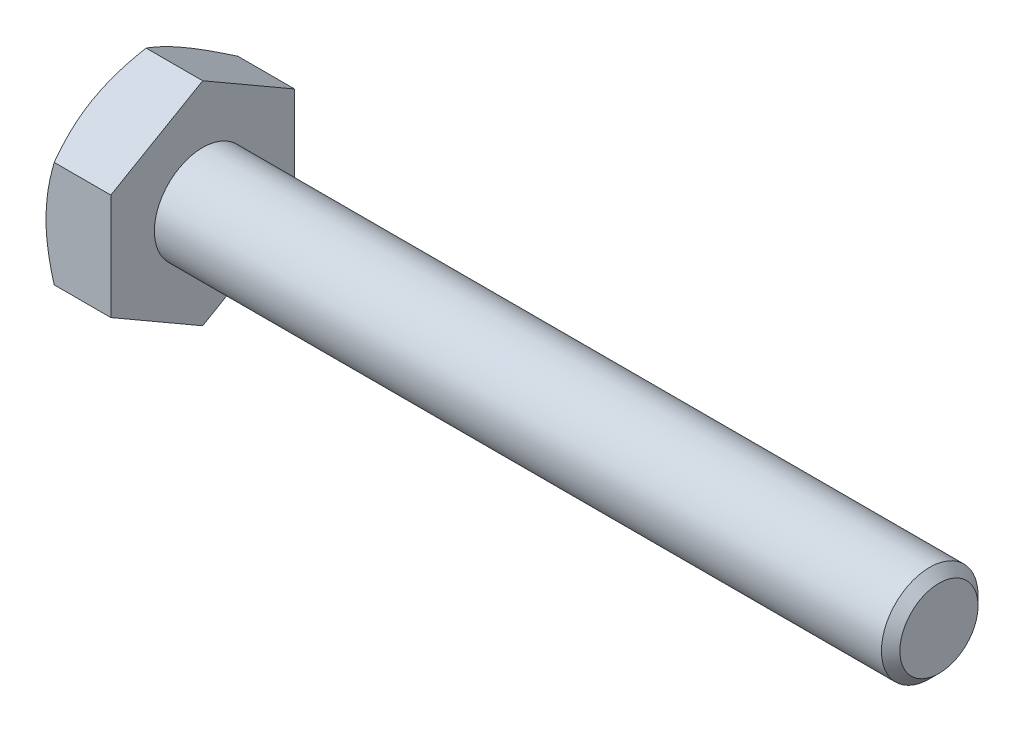
ISO-10303-21;
HEADER;
FILE_DESCRIPTION(('STEP AP214'),'2;1');
FILE_NAME('part.step','',(''),(''),'','','');
FILE_SCHEMA(('AUTOMOTIVE_DESIGN { 1 0 10303 214 1 1 1 1 }'));
ENDSEC;
DATA;
#1=APPLICATION_CONTEXT('core data for automotive mechanical design processes');
#2=APPLICATION_PROTOCOL_DEFINITION('international standard','automotive_design',2000,#1);
#3=PRODUCT_CONTEXT('',#1,'mechanical');
#4=PRODUCT('Part','Part','',(#3));
#5=PRODUCT_RELATED_PRODUCT_CATEGORY('part','',(#4));
#6=PRODUCT_DEFINITION_FORMATION('','',#4);
#7=PRODUCT_DEFINITION_CONTEXT('part definition',#1,'design');
#8=PRODUCT_DEFINITION('design','',#6,#7);
#9=PRODUCT_DEFINITION_SHAPE('','',#8);
#10=(LENGTH_UNIT() NAMED_UNIT(*) SI_UNIT(.MILLI.,.METRE.));
#11=(NAMED_UNIT(*) PLANE_ANGLE_UNIT() SI_UNIT($,.RADIAN.));
#12=(NAMED_UNIT(*) SI_UNIT($,.STERADIAN.) SOLID_ANGLE_UNIT());
#13=UNCERTAINTY_MEASURE_WITH_UNIT(LENGTH_MEASURE(1.E-05),#10,'distance_accuracy_value','');
#14=(GEOMETRIC_REPRESENTATION_CONTEXT(3) GLOBAL_UNCERTAINTY_ASSIGNED_CONTEXT((#13)) GLOBAL_UNIT_ASSIGNED_CONTEXT((#10,
#11,#12)) REPRESENTATION_CONTEXT('',''));
#15=CARTESIAN_POINT('',(0.,0.,0.));
#16=DIRECTION('',(0.,0.,1.));
#17=DIRECTION('',(1.,0.,0.));
#18=AXIS2_PLACEMENT_3D('',#15,#16,#17);
#19=CARTESIAN_POINT('',(-2.5136,0.,0.));
#20=DIRECTION('',(1.,0.,0.));
#21=DIRECTION('',(0.,1.,0.));
#22=AXIS2_PLACEMENT_3D('',#19,#20,#21);
#23=PLANE('',#22);
#24=CARTESIAN_POINT('',(-2.5136,0.,0.));
#25=DIRECTION('',(1.,0.,0.));
#26=DIRECTION('',(0.,1.,0.));
#27=AXIS2_PLACEMENT_3D('',#24,#25,#26);
#28=CIRCLE('',#27,3.16992);
#29=CARTESIAN_POINT('',(-2.5136,3.16992,0.));
#30=VERTEX_POINT('',#29);
#31=EDGE_CURVE('E20',#30,#30,#28,.F.);
#32=ORIENTED_EDGE('',*,*,#31,.T.);
#33=EDGE_LOOP('',(#32));
#34=FACE_BOUND('',#33,.T.);
#35=ADVANCED_FACE('F17',(#34),#23,.F.);
#36=CARTESIAN_POINT('',(-2.794,0.,0.));
#37=DIRECTION('',(1.,0.,0.));
#38=DIRECTION('',(0.,1.,0.));
#39=AXIS2_PLACEMENT_3D('',#36,#37,#38);
#40=CYLINDRICAL_SURFACE('',#39,3.16992);
#41=CARTESIAN_POINT('',(-2.794,0.,0.));
#42=DIRECTION('',(1.,0.,0.));
#43=DIRECTION('',(0.,1.,0.));
#44=AXIS2_PLACEMENT_3D('',#41,#42,#43);
#45=CIRCLE('',#44,3.16992);
#46=CARTESIAN_POINT('',(-2.794,3.16992,0.));
#47=VERTEX_POINT('',#46);
#48=EDGE_CURVE('E115',#47,#47,#45,.F.);
#49=ORIENTED_EDGE('',*,*,#48,.T.);
#50=EDGE_LOOP('',(#49));
#51=FACE_BOUND('',#50,.T.);
#52=ORIENTED_EDGE('',*,*,#31,.F.);
#53=EDGE_LOOP('',(#52));
#54=FACE_BOUND('',#53,.T.);
#55=ADVANCED_FACE('F348',(#51,#54),#40,.F.);
#56=CARTESIAN_POINT('',(-2.794,0.,0.));
#57=DIRECTION('',(1.,0.,0.));
#58=DIRECTION('',(0.,1.,0.));
#59=AXIS2_PLACEMENT_3D('',#56,#57,#58);
#60=PLANE('',#59);
#61=ORIENTED_EDGE('',*,*,#48,.F.);
#62=EDGE_LOOP('',(#61));
#63=FACE_BOUND('',#62,.T.);
#64=CARTESIAN_POINT('',(-2.79399999999441,0.,0.));
#65=DIRECTION('',(1.,0.,0.));
#66=DIRECTION('',(0.,0.,-1.));
#67=AXIS2_PLACEMENT_3D('',#64,#65,#66);
#68=CIRCLE('',#67,3.96239999997761);
#69=CARTESIAN_POINT('',(-2.79399999998795,3.43153905994576,-1.9811999999944));
#70=VERTEX_POINT('',#69);
#71=CARTESIAN_POINT('',(-2.79399999998795,3.43153905994576,1.9811999999944));
#72=VERTEX_POINT('',#71);
#73=EDGE_CURVE('E333',#70,#72,#68,.T.);
#74=ORIENTED_EDGE('',*,*,#73,.F.);
#75=CARTESIAN_POINT('',(-2.79399999999441,0.,0.));
#76=DIRECTION('',(1.,0.,0.));
#77=DIRECTION('',(0.,0.,-1.));
#78=AXIS2_PLACEMENT_3D('',#75,#76,#77);
#79=CIRCLE('',#78,3.96239999997761);
#80=CARTESIAN_POINT('',(-2.79399999998795,0.,-3.9623999999888));
#81=VERTEX_POINT('',#80);
#82=EDGE_CURVE('E334',#81,#70,#79,.T.);
#83=ORIENTED_EDGE('',*,*,#82,.F.);
#84=CARTESIAN_POINT('',(-2.79399999999441,0.,0.));
#85=DIRECTION('',(1.,0.,0.));
#86=DIRECTION('',(0.,0.,-1.));
#87=AXIS2_PLACEMENT_3D('',#84,#85,#86);
#88=CIRCLE('',#87,3.96239999997761);
#89=CARTESIAN_POINT('',(-2.79399999998795,-3.43153905994576,-1.9811999999944));
#90=VERTEX_POINT('',#89);
#91=EDGE_CURVE('E336',#90,#81,#88,.T.);
#92=ORIENTED_EDGE('',*,*,#91,.F.);
#93=CARTESIAN_POINT('',(-2.79399999999441,0.,0.));
#94=DIRECTION('',(1.,0.,0.));
#95=DIRECTION('',(0.,0.,-1.));
#96=AXIS2_PLACEMENT_3D('',#93,#94,#95);
#97=CIRCLE('',#96,3.96239999997761);
#98=CARTESIAN_POINT('',(-2.79399999998795,-3.43153905994576,1.9811999999944));
#99=VERTEX_POINT('',#98);
#100=EDGE_CURVE('E93',#99,#90,#97,.T.);
#101=ORIENTED_EDGE('',*,*,#100,.F.);
#102=CARTESIAN_POINT('',(-2.79399999999441,0.,0.));
#103=DIRECTION('',(1.,0.,0.));
#104=DIRECTION('',(0.,0.,-1.));
#105=AXIS2_PLACEMENT_3D('',#102,#103,#104);
#106=CIRCLE('',#105,3.96239999997761);
#107=CARTESIAN_POINT('',(-2.79399999998795,0.,3.9623999999888));
#108=VERTEX_POINT('',#107);
#109=EDGE_CURVE('E89',#108,#99,#106,.T.);
#110=ORIENTED_EDGE('',*,*,#109,.F.);
#111=CARTESIAN_POINT('',(-2.79399999999441,0.,0.));
#112=DIRECTION('',(1.,0.,0.));
#113=DIRECTION('',(0.,0.,-1.));
#114=AXIS2_PLACEMENT_3D('',#111,#112,#113);
#115=CIRCLE('',#114,3.96239999997761);
#116=EDGE_CURVE('E86',#72,#108,#115,.T.);
#117=ORIENTED_EDGE('',*,*,#116,.F.);
#118=EDGE_LOOP('',(#74,#83,#92,#101,#110,#117));
#119=FACE_BOUND('',#118,.T.);
#120=ADVANCED_FACE('F91',(#63,#119),#60,.F.);
#121=CARTESIAN_POINT('',(-2.43796926281448,0.,0.));
#122=DIRECTION('',(1.,0.,0.));
#123=DIRECTION('',(0.,0.,-1.));
#124=AXIS2_PLACEMENT_3D('',#121,#122,#123);
#125=CONICAL_SURFACE('',#124,4.5790633258207,1.04719755119045);
#126=ORIENTED_EDGE('',*,*,#116,.T.);
#127=CARTESIAN_POINT('',(-2.44009270661787,2.28769270663145,3.96240000000435));
#128=CARTESIAN_POINT('',(-2.49386247127216,2.10147549504004,3.96240000000152));
#129=CARTESIAN_POINT('',(-2.54312496324145,1.91376698910034,3.9624000000004));
#130=CARTESIAN_POINT('',(-2.6299984808673,1.53669534529914,3.9623999999996));
#131=CARTESIAN_POINT('',(-2.66766712049076,1.34734536003662,3.96239999999993));
#132=CARTESIAN_POINT('',(-2.7139178146395,1.06153337782341,3.96240000000004));
#133=CARTESIAN_POINT('',(-2.72763161631743,0.965901675390238,3.96240000000001));
#134=CARTESIAN_POINT('',(-2.75137049289247,0.7741804425831,3.96239999999999));
#135=CARTESIAN_POINT('',(-2.7613956648771,0.678090924326633,3.9624));
#136=CARTESIAN_POINT('',(-2.77758113996479,0.485098636636699,3.9624));
#137=CARTESIAN_POINT('',(-2.78372178856325,0.388194206185193,3.9624));
#138=CARTESIAN_POINT('',(-2.79193971803073,0.194194765652607,3.9624));
#139=CARTESIAN_POINT('',(-2.79401619416263,0.0970997216376882,3.96239999999999));
#140=CARTESIAN_POINT('',(-2.79399999998148,0.,3.9624));
#141=B_SPLINE_CURVE_WITH_KNOTS('',3,(#127,#128,#129,#130,#131,#132,#133,#134,#135,#136,#137,
#138,#139,#140),.UNSPECIFIED.,.F.,.F.,(4,2,2,2,2,2,4),(0.,0.58170937104,1.16047952539746,
1.4502443362909,1.74000151980858,2.03121330078924,2.32248273809135),.UNSPECIFIED.);
#142=CARTESIAN_POINT('',(-2.44009270661524,2.2876927066354,3.96239999999728));
#143=VERTEX_POINT('',#142);
#144=EDGE_CURVE('E112',#143,#108,#141,.T.);
#145=ORIENTED_EDGE('',*,*,#144,.F.);
#146=CARTESIAN_POINT('',(-2.79399999998161,3.43153905995563,1.9812000000001));
#147=CARTESIAN_POINT('',(-2.79401619416268,3.38298919913664,2.06529082563873));
#148=CARTESIAN_POINT('',(-2.79193971803075,3.33444167712912,2.14937760033721));
#149=CARTESIAN_POINT('',(-2.78372178856323,3.23744195686277,2.31738604415842));
#150=CARTESIAN_POINT('',(-2.77758113996478,3.18898974163702,2.40130774266872));
#151=CARTESIAN_POINT('',(-2.76139566487709,3.09249359779204,2.56844396654271));
#152=CARTESIAN_POINT('',(-2.75137049289245,3.0444488386638,2.65165993039022));
#153=CARTESIAN_POINT('',(-2.7276316163174,2.94858822226022,2.81769538844608));
#154=CARTESIAN_POINT('',(-2.71391781463944,2.90077237104363,2.90051487216037));
#155=CARTESIAN_POINT('',(-2.66766712049075,2.75786637993698,3.14803530946308));
#156=CARTESIAN_POINT('',(-2.62999848086746,2.66319138730566,3.31201720690673));
#157=CARTESIAN_POINT('',(-2.54312496324108,2.47465556540505,3.63857082948534));
#158=CARTESIAN_POINT('',(-2.49386247127108,2.38080131243524,3.80113116413547));
#159=CARTESIAN_POINT('',(-2.44009270661503,2.28769270663972,3.96239999999522));
#160=B_SPLINE_CURVE_WITH_KNOTS('',3,(#146,#147,#148,#149,#150,#151,#152,#153,#154,#155,#156,
#157,#158,#159),.UNSPECIFIED.,.F.,.F.,(4,2,2,2,2,2,4),(0.,0.291269437302197,0.582481218282926,
0.872238401800628,1.1620032126941,1.74077336705176,2.32248273809204),.UNSPECIFIED.);
#161=EDGE_CURVE('E106',#72,#143,#160,.T.);
#162=ORIENTED_EDGE('',*,*,#161,.F.);
#163=EDGE_LOOP('',(#126,#145,#162));
#164=FACE_BOUND('',#163,.T.);
#165=ADVANCED_FACE('F111',(#164),#125,.T.);
#166=CARTESIAN_POINT('',(-2.43796926281448,0.,0.));
#167=DIRECTION('',(1.,0.,0.));
#168=DIRECTION('',(0.,0.,-1.));
#169=AXIS2_PLACEMENT_3D('',#166,#167,#168);
#170=CONICAL_SURFACE('',#169,4.5790633258207,1.04719755119045);
#171=CARTESIAN_POINT('',(-2.7939999999816,0.,3.96240000000021));
#172=CARTESIAN_POINT('',(-2.79401619416268,-0.0970997216377546,3.96240000000007));
#173=CARTESIAN_POINT('',(-2.79193971803074,-0.1941947656527,3.96240000000002));
#174=CARTESIAN_POINT('',(-2.78372178856323,-0.388194206185335,3.96239999999998));
#175=CARTESIAN_POINT('',(-2.77758113996478,-0.485098636636862,3.96239999999999));
#176=CARTESIAN_POINT('',(-2.76139566487709,-0.678090924326828,3.9624));
#177=CARTESIAN_POINT('',(-2.75137049289245,-0.774180442583304,3.9624));
#178=CARTESIAN_POINT('',(-2.7276316163174,-0.965901675390458,3.9624));
#179=CARTESIAN_POINT('',(-2.71391781463944,-1.06153337782363,3.9624));
#180=CARTESIAN_POINT('',(-2.66766712049075,-1.34734536003694,3.9624));
#181=CARTESIAN_POINT('',(-2.62999848086746,-1.53669534529958,3.9624));
#182=CARTESIAN_POINT('',(-2.54312496324108,-1.9137669891008,3.9624));
#183=CARTESIAN_POINT('',(-2.49386247127107,-2.10147549504041,3.9624));
#184=CARTESIAN_POINT('',(-2.44009270661502,-2.28769270663146,3.9624));
#185=B_SPLINE_CURVE_WITH_KNOTS('',3,(#171,#172,#173,#174,#175,#176,#177,#178,#179,#180,#181,
#182,#183,#184),.UNSPECIFIED.,.F.,.F.,(4,2,2,2,2,2,4),(0.,0.291269437302197,0.582481218282926,
0.872238401800628,1.1620032126941,1.74077336705176,2.32248273809204),.UNSPECIFIED.);
#186=CARTESIAN_POINT('',(-2.44009270661524,-2.28769270663541,3.96239999999728));
#187=VERTEX_POINT('',#186);
#188=EDGE_CURVE('E99',#108,#187,#185,.T.);
#189=ORIENTED_EDGE('',*,*,#188,.F.);
#190=ORIENTED_EDGE('',*,*,#109,.T.);
#191=CARTESIAN_POINT('',(-2.44009270661787,-2.2876927066435,3.9623999999974));
#192=CARTESIAN_POINT('',(-2.49386247127216,-2.38080131243675,3.80113116413592));
#193=CARTESIAN_POINT('',(-2.54312496324145,-2.47465556540563,3.63857082948515));
#194=CARTESIAN_POINT('',(-2.62999848086729,-2.66319138730554,3.31201720690616));
#195=CARTESIAN_POINT('',(-2.66766712049076,-2.75786637993708,3.14803530946277));
#196=CARTESIAN_POINT('',(-2.7139178146395,-2.90077237104378,2.9005148721602));
#197=CARTESIAN_POINT('',(-2.72763161631743,-2.94858822226034,2.81769538844591));
#198=CARTESIAN_POINT('',(-2.75137049289247,-3.0444488386639,2.65165993039004));
#199=CARTESIAN_POINT('',(-2.7613956648771,-3.09249359779214,2.56844396654254));
#200=CARTESIAN_POINT('',(-2.77758113996479,-3.18898974163711,2.40130774266858));
#201=CARTESIAN_POINT('',(-2.78372178856325,-3.23744195686286,2.31738604415832));
#202=CARTESIAN_POINT('',(-2.79193971803073,-3.33444167712915,2.14937760033713));
#203=CARTESIAN_POINT('',(-2.79401619416263,-3.38298919913661,2.06529082563864));
#204=CARTESIAN_POINT('',(-2.79399999998149,-3.43153905995547,1.98119999999997));
#205=B_SPLINE_CURVE_WITH_KNOTS('',3,(#191,#192,#193,#194,#195,#196,#197,#198,#199,#200,#201,
#202,#203,#204),.UNSPECIFIED.,.F.,.F.,(4,2,2,2,2,2,4),(0.,0.58170937104,1.16047952539746,
1.4502443362909,1.74000151980858,2.03121330078924,2.32248273809135),.UNSPECIFIED.);
#206=EDGE_CURVE('E101',#187,#99,#205,.T.);
#207=ORIENTED_EDGE('',*,*,#206,.F.);
#208=EDGE_LOOP('',(#189,#190,#207));
#209=FACE_BOUND('',#208,.T.);
#210=ADVANCED_FACE('F100',(#209),#170,.T.);
#211=CARTESIAN_POINT('',(-2.43796926281448,0.,0.));
#212=DIRECTION('',(1.,0.,0.));
#213=DIRECTION('',(0.,0.,-1.));
#214=AXIS2_PLACEMENT_3D('',#211,#212,#213);
#215=CONICAL_SURFACE('',#214,4.5790633258207,1.04719755119045);
#216=CARTESIAN_POINT('',(-2.7939999999816,-3.43153905995563,1.9812000000001));
#217=CARTESIAN_POINT('',(-2.79401619416268,-3.4800889207744,1.89710917436135));
#218=CARTESIAN_POINT('',(-2.79193971803074,-3.52863644278182,1.81302239966281));
#219=CARTESIAN_POINT('',(-2.78372178856323,-3.62563616304811,1.64501395584156));
#220=CARTESIAN_POINT('',(-2.77758113996478,-3.67408837827388,1.56109225733128));
#221=CARTESIAN_POINT('',(-2.76139566487709,-3.77058452211887,1.3939560334573));
#222=CARTESIAN_POINT('',(-2.75137049289245,-3.81862928124711,1.31074006960978));
#223=CARTESIAN_POINT('',(-2.7276316163174,-3.91448989765068,1.14470461155391));
#224=CARTESIAN_POINT('',(-2.71391781463944,-3.96230574886727,1.06188512783963));
#225=CARTESIAN_POINT('',(-2.66766712049075,-4.10521173997393,0.814364690536919));
#226=CARTESIAN_POINT('',(-2.62999848086746,-4.19988673260524,0.650382793093268));
#227=CARTESIAN_POINT('',(-2.54312496324108,-4.38842255450585,0.323829170514653));
#228=CARTESIAN_POINT('',(-2.49386247127108,-4.48227680747566,0.161268835864524));
#229=CARTESIAN_POINT('',(-2.44009270661503,-4.57538541327118,4.77407737567543E-12));
#230=B_SPLINE_CURVE_WITH_KNOTS('',3,(#216,#217,#218,#219,#220,#221,#222,#223,#224,#225,#226,
#227,#228,#229),.UNSPECIFIED.,.F.,.F.,(4,2,2,2,2,2,4),(0.,0.291269437302198,0.582481218282927,
0.872238401800629,1.1620032126941,1.74077336705176,2.32248273809204),.UNSPECIFIED.);
#231=CARTESIAN_POINT('',(-2.44009270661524,-4.5753854132708,0.));
#232=VERTEX_POINT('',#231);
#233=EDGE_CURVE('E119',#99,#232,#230,.T.);
#234=ORIENTED_EDGE('',*,*,#233,.F.);
#235=ORIENTED_EDGE('',*,*,#100,.T.);
#236=CARTESIAN_POINT('',(-2.44009270661787,-4.57538541327495,-6.95221713207287E-12));
#237=CARTESIAN_POINT('',(-2.49386247127216,-4.48227680747679,-0.161268835865601));
#238=CARTESIAN_POINT('',(-2.54312496324145,-4.38842255450597,-0.323829170515247));
#239=CARTESIAN_POINT('',(-2.6299984808673,-4.19988673260468,-0.650382793093442));
#240=CARTESIAN_POINT('',(-2.66766712049076,-4.1052117399737,-0.814364690537154));
#241=CARTESIAN_POINT('',(-2.7139178146395,-3.96230574886719,-1.06188512783984));
#242=CARTESIAN_POINT('',(-2.72763161631744,-3.91448989765058,-1.1447046115541));
#243=CARTESIAN_POINT('',(-2.75137049289247,-3.818629281247,-1.31074006960995));
#244=CARTESIAN_POINT('',(-2.7613956648771,-3.77058452211877,-1.39395603345746));
#245=CARTESIAN_POINT('',(-2.77758113996479,-3.67408837827381,-1.56109225733142));
#246=CARTESIAN_POINT('',(-2.78372178856325,-3.62563616304805,-1.64501395584169));
#247=CARTESIAN_POINT('',(-2.79193971803074,-3.52863644278176,-1.81302239966287));
#248=CARTESIAN_POINT('',(-2.79401619416263,-3.48008892077429,-1.89710917436136));
#249=CARTESIAN_POINT('',(-2.79399999998149,-3.43153905995543,-1.98120000000003));
#250=B_SPLINE_CURVE_WITH_KNOTS('',3,(#236,#237,#238,#239,#240,#241,#242,#243,#244,#245,#246,
#247,#248,#249),.UNSPECIFIED.,.F.,.F.,(4,2,2,2,2,2,4),(0.,0.581709371040002,1.16047952539747,
1.4502443362909,1.74000151980858,2.03121330078924,2.32248273809136),.UNSPECIFIED.);
#251=EDGE_CURVE('E215',#232,#90,#250,.T.);
#252=ORIENTED_EDGE('',*,*,#251,.F.);
#253=EDGE_LOOP('',(#234,#235,#252));
#254=FACE_BOUND('',#253,.T.);
#255=ADVANCED_FACE('F223',(#254),#215,.T.);
#256=CARTESIAN_POINT('',(-2.43796926281448,0.,0.));
#257=DIRECTION('',(1.,0.,0.));
#258=DIRECTION('',(0.,0.,-1.));
#259=AXIS2_PLACEMENT_3D('',#256,#257,#258);
#260=CONICAL_SURFACE('',#259,4.5790633258207,1.04719755119045);
#261=CARTESIAN_POINT('',(-2.79399999998161,-3.43153905995563,-1.9812000000001));
#262=CARTESIAN_POINT('',(-2.79401619416268,-3.38298919913664,-2.06529082563873));
#263=CARTESIAN_POINT('',(-2.79193971803075,-3.33444167712912,-2.14937760033721));
#264=CARTESIAN_POINT('',(-2.78372178856323,-3.23744195686277,-2.31738604415842));
#265=CARTESIAN_POINT('',(-2.77758113996478,-3.18898974163702,-2.40130774266871));
#266=CARTESIAN_POINT('',(-2.76139566487709,-3.09249359779204,-2.56844396654271));
#267=CARTESIAN_POINT('',(-2.75137049289245,-3.0444488386638,-2.65165993039022));
#268=CARTESIAN_POINT('',(-2.7276316163174,-2.94858822226022,-2.81769538844608));
#269=CARTESIAN_POINT('',(-2.71391781463944,-2.90077237104364,-2.90051487216037));
#270=CARTESIAN_POINT('',(-2.66766712049075,-2.75786637993698,-3.14803530946308));
#271=CARTESIAN_POINT('',(-2.62999848086746,-2.66319138730566,-3.31201720690673));
#272=CARTESIAN_POINT('',(-2.54312496324108,-2.47465556540505,-3.63857082948534));
#273=CARTESIAN_POINT('',(-2.49386247127108,-2.38080131243524,-3.80113116413547));
#274=CARTESIAN_POINT('',(-2.44009270661503,-2.28769270663972,-3.96239999999522));
#275=B_SPLINE_CURVE_WITH_KNOTS('',3,(#261,#262,#263,#264,#265,#266,#267,#268,#269,#270,#271,
#272,#273,#274),.UNSPECIFIED.,.F.,.F.,(4,2,2,2,2,2,4),(0.,0.291269437302197,0.582481218282926,
0.872238401800628,1.1620032126941,1.74077336705176,2.32248273809204),.UNSPECIFIED.);
#276=CARTESIAN_POINT('',(-2.44009270661524,-2.2876927066354,-3.96239999999728));
#277=VERTEX_POINT('',#276);
#278=EDGE_CURVE('E227',#90,#277,#275,.T.);
#279=ORIENTED_EDGE('',*,*,#278,.F.);
#280=ORIENTED_EDGE('',*,*,#91,.T.);
#281=CARTESIAN_POINT('',(-2.44009270661787,-2.28769270663145,-3.96240000000435));
#282=CARTESIAN_POINT('',(-2.49386247127216,-2.10147549504004,-3.96240000000152));
#283=CARTESIAN_POINT('',(-2.54312496324145,-1.91376698910034,-3.9624000000004));
#284=CARTESIAN_POINT('',(-2.6299984808673,-1.53669534529914,-3.9623999999996));
#285=CARTESIAN_POINT('',(-2.66766712049076,-1.34734536003662,-3.96239999999993));
#286=CARTESIAN_POINT('',(-2.7139178146395,-1.06153337782341,-3.96240000000004));
#287=CARTESIAN_POINT('',(-2.72763161631743,-0.96590167539024,-3.96240000000001));
#288=CARTESIAN_POINT('',(-2.75137049289247,-0.774180442583102,-3.96239999999999));
#289=CARTESIAN_POINT('',(-2.7613956648771,-0.678090924326635,-3.9624));
#290=CARTESIAN_POINT('',(-2.77758113996479,-0.4850986366367,-3.9624));
#291=CARTESIAN_POINT('',(-2.78372178856325,-0.388194206185195,-3.9624));
#292=CARTESIAN_POINT('',(-2.79193971803073,-0.194194765652609,-3.9624));
#293=CARTESIAN_POINT('',(-2.79401619416263,-0.0970997216376899,-3.9624));
#294=CARTESIAN_POINT('',(-2.79399999998148,0.,-3.9624));
#295=B_SPLINE_CURVE_WITH_KNOTS('',3,(#281,#282,#283,#284,#285,#286,#287,#288,#289,#290,#291,
#292,#293,#294),.UNSPECIFIED.,.F.,.F.,(4,2,2,2,2,2,4),(0.,0.58170937104,1.16047952539746,
1.4502443362909,1.74000151980858,2.03121330078924,2.32248273809135),.UNSPECIFIED.);
#296=EDGE_CURVE('E209',#277,#81,#295,.T.);
#297=ORIENTED_EDGE('',*,*,#296,.F.);
#298=EDGE_LOOP('',(#279,#280,#297));
#299=FACE_BOUND('',#298,.T.);
#300=ADVANCED_FACE('F220',(#299),#260,.T.);
#301=CARTESIAN_POINT('',(-2.43796926281448,0.,0.));
#302=DIRECTION('',(1.,0.,0.));
#303=DIRECTION('',(0.,0.,-1.));
#304=AXIS2_PLACEMENT_3D('',#301,#302,#303);
#305=CONICAL_SURFACE('',#304,4.5790633258207,1.04719755119045);
#306=ORIENTED_EDGE('',*,*,#82,.T.);
#307=CARTESIAN_POINT('',(-2.44009270661787,2.2876927066435,-3.9623999999974));
#308=CARTESIAN_POINT('',(-2.49386247127216,2.38080131243675,-3.80113116413592));
#309=CARTESIAN_POINT('',(-2.54312496324145,2.47465556540563,-3.63857082948515));
#310=CARTESIAN_POINT('',(-2.6299984808673,2.66319138730554,-3.31201720690616));
#311=CARTESIAN_POINT('',(-2.66766712049076,2.75786637993708,-3.14803530946277));
#312=CARTESIAN_POINT('',(-2.7139178146395,2.90077237104378,-2.9005148721602));
#313=CARTESIAN_POINT('',(-2.72763161631743,2.94858822226034,-2.8176953884459));
#314=CARTESIAN_POINT('',(-2.75137049289247,3.04444883866389,-2.65165993039004));
#315=CARTESIAN_POINT('',(-2.7613956648771,3.09249359779213,-2.56844396654254));
#316=CARTESIAN_POINT('',(-2.77758113996479,3.18898974163711,-2.40130774266858));
#317=CARTESIAN_POINT('',(-2.78372178856325,3.23744195686286,-2.31738604415832));
#318=CARTESIAN_POINT('',(-2.79193971803073,3.33444167712915,-2.14937760033713));
#319=CARTESIAN_POINT('',(-2.79401619416263,3.38298919913661,-2.06529082563864));
#320=CARTESIAN_POINT('',(-2.79399999998149,3.43153905995547,-1.98119999999997));
#321=B_SPLINE_CURVE_WITH_KNOTS('',3,(#307,#308,#309,#310,#311,#312,#313,#314,#315,#316,#317,
#318,#319,#320),.UNSPECIFIED.,.F.,.F.,(4,2,2,2,2,2,4),(0.,0.581709371040001,1.16047952539747,
1.4502443362909,1.74000151980858,2.03121330078924,2.32248273809136),.UNSPECIFIED.);
#322=CARTESIAN_POINT('',(-2.44009270661524,2.2876927066354,-3.96239999999728));
#323=VERTEX_POINT('',#322);
#324=EDGE_CURVE('E181',#323,#70,#321,.T.);
#325=ORIENTED_EDGE('',*,*,#324,.F.);
#326=CARTESIAN_POINT('',(-2.7939999999816,0.,-3.96240000000021));
#327=CARTESIAN_POINT('',(-2.79401619416267,0.0970997216377522,-3.96240000000007));
#328=CARTESIAN_POINT('',(-2.79193971803074,0.194194765652697,-3.96240000000002));
#329=CARTESIAN_POINT('',(-2.78372178856323,0.388194206185332,-3.96239999999998));
#330=CARTESIAN_POINT('',(-2.77758113996478,0.485098636636859,-3.96239999999999));
#331=CARTESIAN_POINT('',(-2.76139566487709,0.678090924326825,-3.9624));
#332=CARTESIAN_POINT('',(-2.75137049289245,0.774180442583301,-3.9624));
#333=CARTESIAN_POINT('',(-2.7276316163174,0.965901675390454,-3.9624));
#334=CARTESIAN_POINT('',(-2.71391781463944,1.06153337782363,-3.9624));
#335=CARTESIAN_POINT('',(-2.66766712049075,1.34734536003694,-3.9624));
#336=CARTESIAN_POINT('',(-2.62999848086746,1.53669534529957,-3.9624));
#337=CARTESIAN_POINT('',(-2.54312496324108,1.91376698910079,-3.9624));
#338=CARTESIAN_POINT('',(-2.49386247127108,2.10147549504041,-3.9624));
#339=CARTESIAN_POINT('',(-2.44009270661502,2.28769270663146,-3.9624));
#340=B_SPLINE_CURVE_WITH_KNOTS('',3,(#326,#327,#328,#329,#330,#331,#332,#333,#334,#335,#336,
#337,#338,#339),.UNSPECIFIED.,.F.,.F.,(4,2,2,2,2,2,4),(0.,0.291269437302197,0.582481218282925,
0.872238401800627,1.1620032126941,1.74077336705176,2.32248273809204),.UNSPECIFIED.);
#341=EDGE_CURVE('E204',#81,#323,#340,.T.);
#342=ORIENTED_EDGE('',*,*,#341,.F.);
#343=EDGE_LOOP('',(#306,#325,#342));
#344=FACE_BOUND('',#343,.T.);
#345=ADVANCED_FACE('F166',(#344),#305,.T.);
#346=CARTESIAN_POINT('',(-2.43796926281448,0.,0.));
#347=DIRECTION('',(1.,0.,0.));
#348=DIRECTION('',(0.,0.,-1.));
#349=AXIS2_PLACEMENT_3D('',#346,#347,#348);
#350=CONICAL_SURFACE('',#349,4.5790633258207,1.04719755119045);
#351=ORIENTED_EDGE('',*,*,#73,.T.);
#352=CARTESIAN_POINT('',(-2.44009270661787,4.57538541327495,6.95155764973913E-12));
#353=CARTESIAN_POINT('',(-2.49386247127216,4.48227680747679,0.1612688358656));
#354=CARTESIAN_POINT('',(-2.54312496324145,4.38842255450597,0.323829170515246));
#355=CARTESIAN_POINT('',(-2.6299984808673,4.19988673260468,0.650382793093442));
#356=CARTESIAN_POINT('',(-2.66766712049076,4.10521173997371,0.814364690537154));
#357=CARTESIAN_POINT('',(-2.7139178146395,3.96230574886719,1.06188512783984));
#358=CARTESIAN_POINT('',(-2.72763161631744,3.91448989765058,1.1447046115541));
#359=CARTESIAN_POINT('',(-2.75137049289247,3.818629281247,1.31074006960995));
#360=CARTESIAN_POINT('',(-2.76139566487711,3.77058452211877,1.39395603345746));
#361=CARTESIAN_POINT('',(-2.7775811399648,3.67408837827381,1.56109225733142));
#362=CARTESIAN_POINT('',(-2.78372178856325,3.62563616304805,1.64501395584169));
#363=CARTESIAN_POINT('',(-2.79193971803074,3.52863644278176,1.81302239966287));
#364=CARTESIAN_POINT('',(-2.79401619416263,3.48008892077429,1.89710917436136));
#365=CARTESIAN_POINT('',(-2.79399999998149,3.43153905995543,1.98120000000003));
#366=B_SPLINE_CURVE_WITH_KNOTS('',3,(#352,#353,#354,#355,#356,#357,#358,#359,#360,#361,#362,
#363,#364,#365),.UNSPECIFIED.,.F.,.F.,(4,2,2,2,2,2,4),(0.,0.581709371040002,1.16047952539747,
1.4502443362909,1.74000151980858,2.03121330078924,2.32248273809136),.UNSPECIFIED.);
#367=CARTESIAN_POINT('',(-2.44009270661434,4.57538541327237,2.71686784259825E-12));
#368=VERTEX_POINT('',#367);
#369=EDGE_CURVE('E151',#368,#72,#366,.T.);
#370=ORIENTED_EDGE('',*,*,#369,.F.);
#371=CARTESIAN_POINT('',(-2.7939999999816,3.43153905995563,-1.9812000000001));
#372=CARTESIAN_POINT('',(-2.79401619416268,3.4800889207744,-1.89710917436135));
#373=CARTESIAN_POINT('',(-2.79193971803074,3.52863644278182,-1.81302239966281));
#374=CARTESIAN_POINT('',(-2.78372178856323,3.6256361630481,-1.64501395584156));
#375=CARTESIAN_POINT('',(-2.77758113996478,3.67408837827388,-1.56109225733128));
#376=CARTESIAN_POINT('',(-2.76139566487709,3.77058452211887,-1.3939560334573));
#377=CARTESIAN_POINT('',(-2.75137049289245,3.81862928124711,-1.31074006960978));
#378=CARTESIAN_POINT('',(-2.7276316163174,3.91448989765068,-1.14470461155391));
#379=CARTESIAN_POINT('',(-2.71391781463944,3.96230574886727,-1.06188512783963));
#380=CARTESIAN_POINT('',(-2.66766712049075,4.10521173997393,-0.814364690536919));
#381=CARTESIAN_POINT('',(-2.62999848086746,4.19988673260524,-0.650382793093268));
#382=CARTESIAN_POINT('',(-2.54312496324108,4.38842255450585,-0.323829170514653));
#383=CARTESIAN_POINT('',(-2.49386247127108,4.48227680747566,-0.161268835864524));
#384=CARTESIAN_POINT('',(-2.44009270661502,4.57538541327118,-4.77516279774993E-12));
#385=B_SPLINE_CURVE_WITH_KNOTS('',3,(#371,#372,#373,#374,#375,#376,#377,#378,#379,#380,#381,
#382,#383,#384),.UNSPECIFIED.,.F.,.F.,(4,2,2,2,2,2,4),(0.,0.291269437302198,0.582481218282926,
0.872238401800628,1.1620032126941,1.74077336705176,2.32248273809204),.UNSPECIFIED.);
#386=EDGE_CURVE('E172',#70,#368,#385,.T.);
#387=ORIENTED_EDGE('',*,*,#386,.F.);
#388=EDGE_LOOP('',(#351,#370,#387));
#389=FACE_BOUND('',#388,.T.);
#390=ADVANCED_FACE('F160',(#389),#350,.T.);
#391=CARTESIAN_POINT('',(0.,4.57538541327394,0.));
#392=DIRECTION('',(0.,0.866025403784438,0.500000000000001));
#393=DIRECTION('',(0.,-0.500000000000001,0.866025403784438));
#394=AXIS2_PLACEMENT_3D('',#391,#392,#393);
#395=PLANE('',#394);
#396=DIRECTION('',(0.,-0.5,0.866025403784438));
#397=VECTOR('',#396,1.);
#398=CARTESIAN_POINT('',(0.,4.57538541327394,0.));
#399=LINE('',#398,#397);
#400=CARTESIAN_POINT('',(0.,4.57538541327394,0.));
#401=VERTEX_POINT('',#400);
#402=CARTESIAN_POINT('',(0.,2.28769270663697,3.9624));
#403=VERTEX_POINT('',#402);
#404=EDGE_CURVE('E287',#401,#403,#399,.T.);
#405=ORIENTED_EDGE('',*,*,#404,.F.);
#406=DIRECTION('',(1.,0.,0.));
#407=VECTOR('',#406,1.);
#408=CARTESIAN_POINT('',(0.,4.57538541327394,0.));
#409=LINE('',#408,#407);
#410=EDGE_CURVE('E180',#368,#401,#409,.T.);
#411=ORIENTED_EDGE('',*,*,#410,.F.);
#412=ORIENTED_EDGE('',*,*,#369,.T.);
#413=ORIENTED_EDGE('',*,*,#161,.T.);
#414=DIRECTION('',(1.,0.,0.));
#415=VECTOR('',#414,1.);
#416=CARTESIAN_POINT('',(0.,2.28769270663697,3.9624));
#417=LINE('',#416,#415);
#418=EDGE_CURVE('E105',#403,#143,#417,.F.);
#419=ORIENTED_EDGE('',*,*,#418,.F.);
#420=EDGE_LOOP('',(#405,#411,#412,#413,#419));
#421=FACE_BOUND('',#420,.T.);
#422=ADVANCED_FACE('F157',(#421),#395,.T.);
#423=CARTESIAN_POINT('',(0.,2.28769270663697,3.9624));
#424=DIRECTION('',(0.,0.,1.));
#425=DIRECTION('',(0.,-1.,0.));
#426=AXIS2_PLACEMENT_3D('',#423,#424,#425);
#427=PLANE('',#426);
#428=ORIENTED_EDGE('',*,*,#418,.T.);
#429=ORIENTED_EDGE('',*,*,#144,.T.);
#430=ORIENTED_EDGE('',*,*,#188,.T.);
#431=DIRECTION('',(1.,0.,0.));
#432=VECTOR('',#431,1.);
#433=CARTESIAN_POINT('',(0.,-2.28769270663697,3.9624));
#434=LINE('',#433,#432);
#435=CARTESIAN_POINT('',(0.,-2.28769270663697,3.9624));
#436=VERTEX_POINT('',#435);
#437=EDGE_CURVE('E121',#436,#187,#434,.F.);
#438=ORIENTED_EDGE('',*,*,#437,.F.);
#439=DIRECTION('',(0.,1.,0.));
#440=VECTOR('',#439,1.);
#441=CARTESIAN_POINT('',(0.,0.,3.9624));
#442=LINE('',#441,#440);
#443=EDGE_CURVE('E289',#403,#436,#442,.F.);
#444=ORIENTED_EDGE('',*,*,#443,.F.);
#445=EDGE_LOOP('',(#428,#429,#430,#438,#444));
#446=FACE_BOUND('',#445,.T.);
#447=ADVANCED_FACE('F117',(#446),#427,.T.);
#448=CARTESIAN_POINT('',(0.,-2.28769270663697,3.9624));
#449=DIRECTION('',(0.,-0.866025403784439,0.499999999999999));
#450=DIRECTION('',(0.,-0.499999999999999,-0.866025403784439));
#451=AXIS2_PLACEMENT_3D('',#448,#449,#450);
#452=PLANE('',#451);
#453=ORIENTED_EDGE('',*,*,#437,.T.);
#454=ORIENTED_EDGE('',*,*,#206,.T.);
#455=ORIENTED_EDGE('',*,*,#233,.T.);
#456=DIRECTION('',(1.,0.,0.));
#457=VECTOR('',#456,1.);
#458=CARTESIAN_POINT('',(0.,-4.57538541327394,0.));
#459=LINE('',#458,#457);
#460=CARTESIAN_POINT('',(0.,-4.57538541327394,0.));
#461=VERTEX_POINT('',#460);
#462=EDGE_CURVE('E232',#461,#232,#459,.F.);
#463=ORIENTED_EDGE('',*,*,#462,.F.);
#464=DIRECTION('',(0.,-0.499999999999999,-0.866025403784439));
#465=VECTOR('',#464,1.);
#466=CARTESIAN_POINT('',(0.,-2.28769270663697,3.9624));
#467=LINE('',#466,#465);
#468=EDGE_CURVE('E280',#436,#461,#467,.T.);
#469=ORIENTED_EDGE('',*,*,#468,.F.);
#470=EDGE_LOOP('',(#453,#454,#455,#463,#469));
#471=FACE_BOUND('',#470,.T.);
#472=ADVANCED_FACE('F236',(#471),#452,.T.);
#473=CARTESIAN_POINT('',(0.,-4.57538541327394,0.));
#474=DIRECTION('',(0.,-0.866025403784438,-0.500000000000001));
#475=DIRECTION('',(0.,0.500000000000001,-0.866025403784438));
#476=AXIS2_PLACEMENT_3D('',#473,#474,#475);
#477=PLANE('',#476);
#478=ORIENTED_EDGE('',*,*,#462,.T.);
#479=ORIENTED_EDGE('',*,*,#251,.T.);
#480=ORIENTED_EDGE('',*,*,#278,.T.);
#481=DIRECTION('',(1.,0.,0.));
#482=VECTOR('',#481,1.);
#483=CARTESIAN_POINT('',(0.,-2.28769270663697,-3.9624));
#484=LINE('',#483,#482);
#485=CARTESIAN_POINT('',(0.,-2.28769270663697,-3.9624));
#486=VERTEX_POINT('',#485);
#487=EDGE_CURVE('E310',#486,#277,#484,.F.);
#488=ORIENTED_EDGE('',*,*,#487,.F.);
#489=DIRECTION('',(0.,0.5,-0.866025403784438));
#490=VECTOR('',#489,1.);
#491=CARTESIAN_POINT('',(0.,-4.57538541327394,0.));
#492=LINE('',#491,#490);
#493=EDGE_CURVE('E276',#461,#486,#492,.T.);
#494=ORIENTED_EDGE('',*,*,#493,.F.);
#495=EDGE_LOOP('',(#478,#479,#480,#488,#494));
#496=FACE_BOUND('',#495,.T.);
#497=ADVANCED_FACE('F201',(#496),#477,.T.);
#498=CARTESIAN_POINT('',(0.,-2.28769270663697,-3.9624));
#499=DIRECTION('',(0.,0.,-1.));
#500=DIRECTION('',(0.,1.,0.));
#501=AXIS2_PLACEMENT_3D('',#498,#499,#500);
#502=PLANE('',#501);
#503=DIRECTION('',(0.,1.,0.));
#504=VECTOR('',#503,1.);
#505=CARTESIAN_POINT('',(0.,0.,-3.9624));
#506=LINE('',#505,#504);
#507=CARTESIAN_POINT('',(0.,2.28769270663697,-3.9624));
#508=VERTEX_POINT('',#507);
#509=EDGE_CURVE('E271',#486,#508,#506,.T.);
#510=ORIENTED_EDGE('',*,*,#509,.F.);
#511=ORIENTED_EDGE('',*,*,#487,.T.);
#512=ORIENTED_EDGE('',*,*,#296,.T.);
#513=ORIENTED_EDGE('',*,*,#341,.T.);
#514=DIRECTION('',(1.,0.,0.));
#515=VECTOR('',#514,1.);
#516=CARTESIAN_POINT('',(0.,2.28769270663697,-3.9624));
#517=LINE('',#516,#515);
#518=EDGE_CURVE('E35',#508,#323,#517,.F.);
#519=ORIENTED_EDGE('',*,*,#518,.F.);
#520=EDGE_LOOP('',(#510,#511,#512,#513,#519));
#521=FACE_BOUND('',#520,.T.);
#522=ADVANCED_FACE('F194',(#521),#502,.T.);
#523=CARTESIAN_POINT('',(0.,2.28769270663697,-3.9624));
#524=DIRECTION('',(0.,0.866025403784439,-0.5));
#525=DIRECTION('',(0.,0.5,0.866025403784439));
#526=AXIS2_PLACEMENT_3D('',#523,#524,#525);
#527=PLANE('',#526);
#528=DIRECTION('',(0.,0.499999999999999,0.866025403784439));
#529=VECTOR('',#528,1.);
#530=CARTESIAN_POINT('',(0.,2.28769270663697,-3.9624));
#531=LINE('',#530,#529);
#532=EDGE_CURVE('E273',#508,#401,#531,.T.);
#533=ORIENTED_EDGE('',*,*,#532,.F.);
#534=ORIENTED_EDGE('',*,*,#518,.T.);
#535=ORIENTED_EDGE('',*,*,#324,.T.);
#536=ORIENTED_EDGE('',*,*,#386,.T.);
#537=ORIENTED_EDGE('',*,*,#410,.T.);
#538=EDGE_LOOP('',(#533,#534,#535,#536,#537));
#539=FACE_BOUND('',#538,.T.);
#540=ADVANCED_FACE('F188',(#539),#527,.T.);
#541=CARTESIAN_POINT('',(31.75,1.0414,0.));
#542=DIRECTION('',(1.,0.,0.));
#543=DIRECTION('',(0.,1.,0.));
#544=AXIS2_PLACEMENT_3D('',#541,#542,#543);
#545=PLANE('',#544);
#546=CARTESIAN_POINT('',(31.7499999999882,0.,0.));
#547=DIRECTION('',(-1.,0.,0.));
#548=DIRECTION('',(0.,0.,1.));
#549=AXIS2_PLACEMENT_3D('',#546,#547,#548);
#550=CIRCLE('',#549,1.68529000001172);
#551=CARTESIAN_POINT('',(31.7499999999882,0.,1.68529000001172));
#552=VERTEX_POINT('',#551);
#553=EDGE_CURVE('E182',#552,#552,#550,.T.);
#554=ORIENTED_EDGE('',*,*,#553,.F.);
#555=EDGE_LOOP('',(#554));
#556=FACE_BOUND('',#555,.T.);
#557=ADVANCED_FACE('F193',(#556),#545,.T.);
#558=CARTESIAN_POINT('',(0.,0.,0.));
#559=DIRECTION('',(1.,0.,0.));
#560=DIRECTION('',(0.,1.,0.));
#561=AXIS2_PLACEMENT_3D('',#558,#559,#560);
#562=PLANE('',#561);
#563=CARTESIAN_POINT('',(0.,0.,0.));
#564=DIRECTION('',(1.,0.,0.));
#565=DIRECTION('',(0.,1.,0.));
#566=AXIS2_PLACEMENT_3D('',#563,#564,#565);
#567=CIRCLE('',#566,2.0828);
#568=CARTESIAN_POINT('',(0.,2.0828,0.));
#569=VERTEX_POINT('',#568);
#570=EDGE_CURVE('E26',#569,#569,#567,.T.);
#571=ORIENTED_EDGE('',*,*,#570,.F.);
#572=EDGE_LOOP('',(#571));
#573=FACE_BOUND('',#572,.T.);
#574=ORIENTED_EDGE('',*,*,#509,.T.);
#575=ORIENTED_EDGE('',*,*,#532,.T.);
#576=ORIENTED_EDGE('',*,*,#404,.T.);
#577=ORIENTED_EDGE('',*,*,#443,.T.);
#578=ORIENTED_EDGE('',*,*,#468,.T.);
#579=ORIENTED_EDGE('',*,*,#493,.T.);
#580=EDGE_LOOP('',(#574,#575,#576,#577,#578,#579));
#581=FACE_BOUND('',#580,.T.);
#582=ADVANCED_FACE('F255',(#573,#581),#562,.T.);
#583=CARTESIAN_POINT('',(31.3523900000519,0.,0.));
#584=DIRECTION('',(-1.,0.,0.));
#585=DIRECTION('',(0.,0.,1.));
#586=AXIS2_PLACEMENT_3D('',#583,#584,#585);
#587=CONICAL_SURFACE('',#586,2.0827999999824,0.785272396261512);
#588=ORIENTED_EDGE('',*,*,#553,.T.);
#589=EDGE_LOOP('',(#588));
#590=FACE_BOUND('',#589,.T.);
#591=CARTESIAN_POINT('',(31.3523900000001,0.,0.));
#592=DIRECTION('',(1.,0.,0.));
#593=DIRECTION('',(0.,1.,0.));
#594=AXIS2_PLACEMENT_3D('',#591,#592,#593);
#595=CIRCLE('',#594,2.0828);
#596=CARTESIAN_POINT('',(31.3523900000001,2.0828,0.));
#597=VERTEX_POINT('',#596);
#598=EDGE_CURVE('E11',#597,#597,#595,.F.);
#599=ORIENTED_EDGE('',*,*,#598,.F.);
#600=EDGE_LOOP('',(#599));
#601=FACE_BOUND('',#600,.T.);
#602=ADVANCED_FACE('F249',(#590,#601),#587,.T.);
#603=CARTESIAN_POINT('',(15.875,0.,0.));
#604=DIRECTION('',(1.,0.,0.));
#605=DIRECTION('',(0.,1.,0.));
#606=AXIS2_PLACEMENT_3D('',#603,#604,#605);
#607=CYLINDRICAL_SURFACE('',#606,2.0828);
#608=ORIENTED_EDGE('',*,*,#598,.T.);
#609=EDGE_LOOP('',(#608));
#610=FACE_BOUND('',#609,.T.);
#611=ORIENTED_EDGE('',*,*,#570,.T.);
#612=EDGE_LOOP('',(#611));
#613=FACE_BOUND('',#612,.T.);
#614=ADVANCED_FACE('F247',(#610,#613),#607,.T.);
#615=CLOSED_SHELL('',(#35,#55,#120,#165,#210,#255,#300,#345,#390,#422,#447,#472,#497,#522,#540,
#557,#582,#602,#614));
#616=MANIFOLD_SOLID_BREP('B1',#615);
#617=ADVANCED_BREP_SHAPE_REPRESENTATION('',(#18,#616),#14);
#618=SHAPE_DEFINITION_REPRESENTATION(#9,#617);
ENDSEC;
END-ISO-10303-21;
